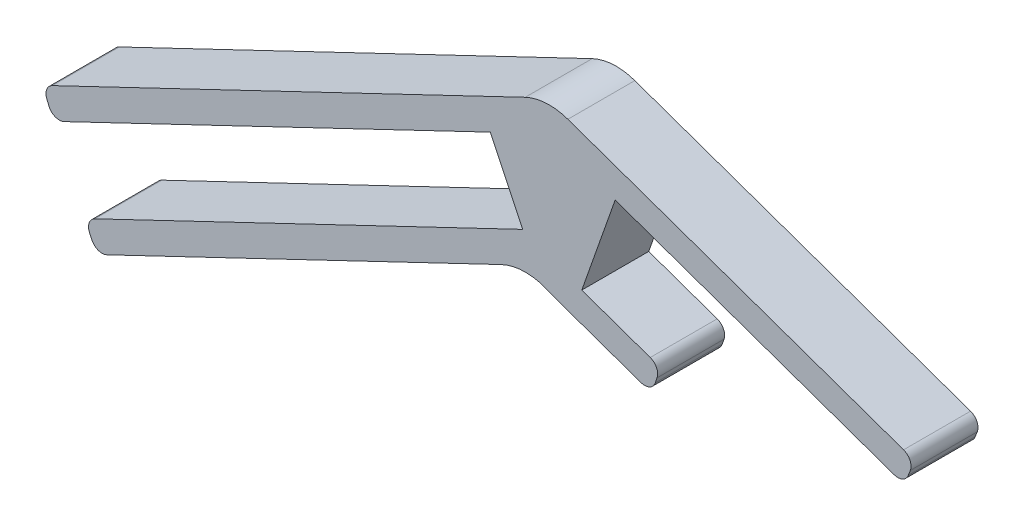
ISO-10303-21;
HEADER;
FILE_DESCRIPTION(('STEP AP214'),'2;1');
FILE_NAME('part.step','',(''),(''),'','','');
FILE_SCHEMA(('AUTOMOTIVE_DESIGN { 1 0 10303 214 1 1 1 1 }'));
ENDSEC;
DATA;
#1=APPLICATION_CONTEXT('core data for automotive mechanical design processes');
#2=APPLICATION_PROTOCOL_DEFINITION('international standard','automotive_design',2000,#1);
#3=PRODUCT_CONTEXT('',#1,'mechanical');
#4=PRODUCT('Part','Part','',(#3));
#5=PRODUCT_RELATED_PRODUCT_CATEGORY('part','',(#4));
#6=PRODUCT_DEFINITION_FORMATION('','',#4);
#7=PRODUCT_DEFINITION_CONTEXT('part definition',#1,'design');
#8=PRODUCT_DEFINITION('design','',#6,#7);
#9=PRODUCT_DEFINITION_SHAPE('','',#8);
#10=(LENGTH_UNIT() NAMED_UNIT(*) SI_UNIT(.MILLI.,.METRE.));
#11=(NAMED_UNIT(*) PLANE_ANGLE_UNIT() SI_UNIT($,.RADIAN.));
#12=(NAMED_UNIT(*) SI_UNIT($,.STERADIAN.) SOLID_ANGLE_UNIT());
#13=UNCERTAINTY_MEASURE_WITH_UNIT(LENGTH_MEASURE(1.E-05),#10,'distance_accuracy_value','');
#14=(GEOMETRIC_REPRESENTATION_CONTEXT(3) GLOBAL_UNCERTAINTY_ASSIGNED_CONTEXT((#13)) GLOBAL_UNIT_ASSIGNED_CONTEXT((#10,
#11,#12)) REPRESENTATION_CONTEXT('',''));
#15=CARTESIAN_POINT('',(0.,0.,0.));
#16=DIRECTION('',(0.,0.,1.));
#17=DIRECTION('',(1.,0.,0.));
#18=AXIS2_PLACEMENT_3D('',#15,#16,#17);
#19=CARTESIAN_POINT('',(61.5968500605202,-23.8454699520847,12.));
#20=DIRECTION('',(0.932560310154677,-0.361014221221563,0.));
#21=DIRECTION('',(0.361014221221563,0.932560310154677,0.));
#22=AXIS2_PLACEMENT_3D('',#19,#20,#21);
#23=PLANE('',#22);
#24=DIRECTION('',(-0.361014221221563,-0.932560310154677,0.));
#25=VECTOR('',#24,1.);
#26=CARTESIAN_POINT('',(61.5968500605202,-23.8454699520847,12.));
#27=LINE('',#26,#25);
#28=CARTESIAN_POINT('',(66.1998726562374,-11.9550902186044,12.));
#29=VERTEX_POINT('',#28);
#30=CARTESIAN_POINT('',(65.8386923064239,-12.8880796667879,12.));
#31=VERTEX_POINT('',#30);
#32=EDGE_CURVE('E291',#29,#31,#27,.T.);
#33=ORIENTED_EDGE('',*,*,#32,.T.);
#34=DIRECTION('',(0.,0.,-1.));
#35=VECTOR('',#34,1.);
#36=CARTESIAN_POINT('',(65.8386923064239,-12.8880796667879,0.));
#37=LINE('',#36,#35);
#38=CARTESIAN_POINT('',(65.8386923064239,-12.8880796667879,0.));
#39=VERTEX_POINT('',#38);
#40=EDGE_CURVE('E347',#31,#39,#37,.T.);
#41=ORIENTED_EDGE('',*,*,#40,.T.);
#42=DIRECTION('',(-0.361014221221563,-0.932560310154677,0.));
#43=VECTOR('',#42,1.);
#44=CARTESIAN_POINT('',(61.5968500605202,-23.8454699520847,0.));
#45=LINE('',#44,#43);
#46=CARTESIAN_POINT('',(66.1998726562374,-11.9550902186044,0.));
#47=VERTEX_POINT('',#46);
#48=EDGE_CURVE('E253',#47,#39,#45,.T.);
#49=ORIENTED_EDGE('',*,*,#48,.F.);
#50=DIRECTION('',(0.,0.,-1.));
#51=VECTOR('',#50,1.);
#52=CARTESIAN_POINT('',(66.1998726562374,-11.9550902186044,12.));
#53=LINE('',#52,#51);
#54=EDGE_CURVE('E345',#47,#29,#53,.F.);
#55=ORIENTED_EDGE('',*,*,#54,.T.);
#56=EDGE_LOOP('',(#33,#41,#49,#55));
#57=FACE_BOUND('',#56,.T.);
#58=ADVANCED_FACE('F35',(#57),#23,.T.);
#59=CARTESIAN_POINT('',(4.25749301558519,12.0732338085579,12.));
#60=DIRECTION('',(0.332566690182013,0.943079740309048,0.));
#61=DIRECTION('',(-0.943079740309048,0.332566690182013,0.));
#62=AXIS2_PLACEMENT_3D('',#59,#60,#61);
#63=PLANE('',#62);
#64=DIRECTION('',(0.943079740309048,-0.332566690182013,0.));
#65=VECTOR('',#64,1.);
#66=CARTESIAN_POINT('',(4.25749301558519,12.0732338085579,12.));
#67=LINE('',#66,#65);
#68=CARTESIAN_POINT('',(4.83492254044177,11.8696096422366,12.));
#69=VERTEX_POINT('',#68);
#70=CARTESIAN_POINT('',(64.9998854162921,-9.34690229554322,12.));
#71=VERTEX_POINT('',#70);
#72=EDGE_CURVE('E473',#69,#71,#67,.T.);
#73=ORIENTED_EDGE('',*,*,#72,.T.);
#74=DIRECTION('',(0.,0.,-1.));
#75=VECTOR('',#74,1.);
#76=CARTESIAN_POINT('',(64.999885416292,-9.34690229554321,12.));
#77=LINE('',#76,#75);
#78=CARTESIAN_POINT('',(64.9998854162921,-9.34690229554322,0.));
#79=VERTEX_POINT('',#78);
#80=EDGE_CURVE('E352',#71,#79,#77,.T.);
#81=ORIENTED_EDGE('',*,*,#80,.T.);
#82=DIRECTION('',(0.943079740309048,-0.332566690182013,0.));
#83=VECTOR('',#82,1.);
#84=CARTESIAN_POINT('',(4.25749301558519,12.0732338085579,0.));
#85=LINE('',#84,#83);
#86=CARTESIAN_POINT('',(4.83492254044177,11.8696096422366,0.));
#87=VERTEX_POINT('',#86);
#88=EDGE_CURVE('E256',#87,#79,#85,.T.);
#89=ORIENTED_EDGE('',*,*,#88,.F.);
#90=DIRECTION('',(0.,0.,-1.));
#91=VECTOR('',#90,1.);
#92=CARTESIAN_POINT('',(4.83492254044177,11.8696096422366,12.));
#93=LINE('',#92,#91);
#94=EDGE_CURVE('E303',#87,#69,#93,.F.);
#95=ORIENTED_EDGE('',*,*,#94,.T.);
#96=EDGE_LOOP('',(#73,#81,#89,#95));
#97=FACE_BOUND('',#96,.T.);
#98=ADVANCED_FACE('F470',(#97),#63,.T.);
#99=CARTESIAN_POINT('',(-4.98538164406063,10.4167868279937,12.));
#100=DIRECTION('',(-0.431697917747711,0.902018241396642,0.));
#101=DIRECTION('',(-0.902018241396642,-0.431697917747711,0.));
#102=AXIS2_PLACEMENT_3D('',#99,#100,#101);
#103=PLANE('',#102);
#104=DIRECTION('',(0.902018241396642,0.431697917747711,0.));
#105=VECTOR('',#104,1.);
#106=CARTESIAN_POINT('',(-4.98538164406063,10.4167868279937,0.));
#107=LINE('',#106,#105);
#108=CARTESIAN_POINT('',(-87.5496802623476,-29.0977530760187,0.));
#109=VERTEX_POINT('',#108);
#110=CARTESIAN_POINT('',(-2.80772353885546,11.4589946531125,0.));
#111=VERTEX_POINT('',#110);
#112=EDGE_CURVE('E259',#109,#111,#107,.T.);
#113=ORIENTED_EDGE('',*,*,#112,.F.);
#114=DIRECTION('',(0.,0.,-1.));
#115=VECTOR('',#114,1.);
#116=CARTESIAN_POINT('',(-87.5496802623476,-29.0977530760187,12.));
#117=LINE('',#116,#115);
#118=CARTESIAN_POINT('',(-87.5496802623476,-29.0977530760187,12.));
#119=VERTEX_POINT('',#118);
#120=EDGE_CURVE('E11',#109,#119,#117,.F.);
#121=ORIENTED_EDGE('',*,*,#120,.T.);
#122=DIRECTION('',(0.902018241396642,0.431697917747711,0.));
#123=VECTOR('',#122,1.);
#124=CARTESIAN_POINT('',(-4.98538164406063,10.4167868279937,12.));
#125=LINE('',#124,#123);
#126=CARTESIAN_POINT('',(-2.80772353885546,11.4589946531125,12.));
#127=VERTEX_POINT('',#126);
#128=EDGE_CURVE('E392',#119,#127,#125,.T.);
#129=ORIENTED_EDGE('',*,*,#128,.T.);
#130=DIRECTION('',(0.,0.,-1.));
#131=VECTOR('',#130,1.);
#132=CARTESIAN_POINT('',(-2.80772353885546,11.4589946531125,12.));
#133=LINE('',#132,#131);
#134=EDGE_CURVE('E220',#127,#111,#133,.T.);
#135=ORIENTED_EDGE('',*,*,#134,.T.);
#136=EDGE_LOOP('',(#113,#121,#129,#135));
#137=FACE_BOUND('',#136,.T.);
#138=ADVANCED_FACE('F480',(#137),#103,.T.);
#139=CARTESIAN_POINT('',(-86.4345541039312,-36.6224392480856,12.));
#140=DIRECTION('',(0.920760796810772,0.390127613809113,0.));
#141=DIRECTION('',(-0.390127613809113,0.920760796810772,0.));
#142=AXIS2_PLACEMENT_3D('',#139,#140,#141);
#143=PLANE('',#142);
#144=DIRECTION('',(0.390127613809113,-0.920760796810772,0.));
#145=VECTOR('',#144,1.);
#146=CARTESIAN_POINT('',(-86.4345541039312,-36.6224392480856,0.));
#147=LINE('',#146,#145);
#148=CARTESIAN_POINT('',(-88.5278060204737,-31.6820447864302,0.));
#149=VERTEX_POINT('',#148);
#150=CARTESIAN_POINT('',(-88.1372723739966,-32.6037638823967,0.));
#151=VERTEX_POINT('',#150);
#152=EDGE_CURVE('E261',#149,#151,#147,.T.);
#153=ORIENTED_EDGE('',*,*,#152,.T.);
#154=DIRECTION('',(0.,0.,-1.));
#155=VECTOR('',#154,1.);
#156=CARTESIAN_POINT('',(-88.1372723739966,-32.6037638823967,12.));
#157=LINE('',#156,#155);
#158=CARTESIAN_POINT('',(-88.1372723739966,-32.6037638823967,12.));
#159=VERTEX_POINT('',#158);
#160=EDGE_CURVE('E43',#151,#159,#157,.F.);
#161=ORIENTED_EDGE('',*,*,#160,.T.);
#162=DIRECTION('',(0.390127613809113,-0.920760796810772,0.));
#163=VECTOR('',#162,1.);
#164=CARTESIAN_POINT('',(-86.4345541039312,-36.6224392480856,12.));
#165=LINE('',#164,#163);
#166=CARTESIAN_POINT('',(-88.5278060204737,-31.6820447864302,12.));
#167=VERTEX_POINT('',#166);
#168=EDGE_CURVE('E210',#167,#159,#165,.T.);
#169=ORIENTED_EDGE('',*,*,#168,.F.);
#170=DIRECTION('',(0.,0.,-1.));
#171=VECTOR('',#170,1.);
#172=CARTESIAN_POINT('',(-88.5278060204737,-31.6820447864302,0.));
#173=LINE('',#172,#171);
#174=EDGE_CURVE('E381',#167,#149,#173,.T.);
#175=ORIENTED_EDGE('',*,*,#174,.T.);
#176=EDGE_LOOP('',(#153,#161,#169,#175));
#177=FACE_BOUND('',#176,.T.);
#178=ADVANCED_FACE('F386',(#177),#143,.F.);
#179=CARTESIAN_POINT('',(-2.82689205532207,5.90669562101049,12.));
#180=DIRECTION('',(-0.431697917747711,0.902018241396642,0.));
#181=DIRECTION('',(-0.902018241396642,-0.431697917747711,0.));
#182=AXIS2_PLACEMENT_3D('',#179,#180,#181);
#183=PLANE('',#182);
#184=DIRECTION('',(0.902018241396642,0.431697917747711,0.));
#185=VECTOR('',#184,1.);
#186=CARTESIAN_POINT('',(-2.82689205532207,5.90669562101049,12.));
#187=LINE('',#186,#185);
#188=CARTESIAN_POINT('',(-85.4323549448797,-33.6275451375718,12.));
#189=VERTEX_POINT('',#188);
#190=CARTESIAN_POINT('',(-9.07000207391761,2.91879862335715,12.));
#191=VERTEX_POINT('',#190);
#192=EDGE_CURVE('E201',#189,#191,#187,.T.);
#193=ORIENTED_EDGE('',*,*,#192,.F.);
#194=DIRECTION('',(0.,0.,-1.));
#195=VECTOR('',#194,1.);
#196=CARTESIAN_POINT('',(-85.4323549448796,-33.6275451375718,12.));
#197=LINE('',#196,#195);
#198=CARTESIAN_POINT('',(-85.4323549448797,-33.6275451375718,0.));
#199=VERTEX_POINT('',#198);
#200=EDGE_CURVE('E379',#189,#199,#197,.T.);
#201=ORIENTED_EDGE('',*,*,#200,.T.);
#202=DIRECTION('',(0.902018241396642,0.431697917747711,0.));
#203=VECTOR('',#202,1.);
#204=CARTESIAN_POINT('',(-2.82689205532207,5.90669562101049,0.));
#205=LINE('',#204,#203);
#206=CARTESIAN_POINT('',(-9.07000207391761,2.91879862335715,0.));
#207=VERTEX_POINT('',#206);
#208=EDGE_CURVE('E216',#199,#207,#205,.T.);
#209=ORIENTED_EDGE('',*,*,#208,.T.);
#210=DIRECTION('',(0.,0.,-1.));
#211=VECTOR('',#210,1.);
#212=CARTESIAN_POINT('',(-9.07000207391761,2.91879862335715,12.));
#213=LINE('',#212,#211);
#214=EDGE_CURVE('E213',#191,#207,#213,.T.);
#215=ORIENTED_EDGE('',*,*,#214,.F.);
#216=EDGE_LOOP('',(#193,#201,#209,#215));
#217=FACE_BOUND('',#216,.T.);
#218=ADVANCED_FACE('F214',(#217),#183,.F.);
#219=CARTESIAN_POINT('',(-6.24311001859554,-2.98789699765333,12.));
#220=DIRECTION('',(-0.902018241396642,-0.431697917747711,0.));
#221=DIRECTION('',(0.431697917747711,-0.902018241396642,0.));
#222=AXIS2_PLACEMENT_3D('',#219,#220,#221);
#223=PLANE('',#222);
#224=DIRECTION('',(-0.431697917747711,0.902018241396642,0.));
#225=VECTOR('',#224,1.);
#226=CARTESIAN_POINT('',(-6.24311001859554,-2.98789699765333,0.));
#227=LINE('',#226,#225);
#228=CARTESIAN_POINT('',(-3.24208018432351,-9.25844763549751,0.));
#229=VERTEX_POINT('',#228);
#230=EDGE_CURVE('E265',#229,#207,#227,.T.);
#231=ORIENTED_EDGE('',*,*,#230,.F.);
#232=DIRECTION('',(0.,0.,-1.));
#233=VECTOR('',#232,1.);
#234=CARTESIAN_POINT('',(-3.24208018432351,-9.25844763549751,12.));
#235=LINE('',#234,#233);
#236=CARTESIAN_POINT('',(-3.24208018432351,-9.25844763549751,12.));
#237=VERTEX_POINT('',#236);
#238=EDGE_CURVE('E221',#237,#229,#235,.T.);
#239=ORIENTED_EDGE('',*,*,#238,.F.);
#240=DIRECTION('',(-0.431697917747711,0.902018241396642,0.));
#241=VECTOR('',#240,1.);
#242=CARTESIAN_POINT('',(-6.24311001859554,-2.98789699765333,12.));
#243=LINE('',#242,#241);
#244=EDGE_CURVE('E206',#237,#191,#243,.T.);
#245=ORIENTED_EDGE('',*,*,#244,.T.);
#246=ORIENTED_EDGE('',*,*,#214,.T.);
#247=EDGE_LOOP('',(#231,#239,#245,#246));
#248=FACE_BOUND('',#247,.T.);
#249=ADVANCED_FACE('F224',(#248),#223,.T.);
#250=CARTESIAN_POINT('',(3.00102983427203,-6.27055063784417,12.));
#251=DIRECTION('',(-0.431697917747711,0.902018241396642,0.));
#252=DIRECTION('',(-0.902018241396642,-0.431697917747711,0.));
#253=AXIS2_PLACEMENT_3D('',#250,#251,#252);
#254=PLANE('',#253);
#255=DIRECTION('',(0.902018241396642,0.431697917747711,0.));
#256=VECTOR('',#255,1.);
#257=CARTESIAN_POINT('',(3.00102983427203,-6.27055063784417,0.));
#258=LINE('',#257,#256);
#259=CARTESIAN_POINT('',(-79.9233276750008,-45.9574115286966,0.));
#260=VERTEX_POINT('',#259);
#261=EDGE_CURVE('E267',#260,#229,#258,.T.);
#262=ORIENTED_EDGE('',*,*,#261,.F.);
#263=DIRECTION('',(0.,0.,-1.));
#264=VECTOR('',#263,1.);
#265=CARTESIAN_POINT('',(-79.9233276750008,-45.9574115286966,12.));
#266=LINE('',#265,#264);
#267=CARTESIAN_POINT('',(-79.9233276750008,-45.9574115286966,12.));
#268=VERTEX_POINT('',#267);
#269=EDGE_CURVE('E50',#260,#268,#266,.F.);
#270=ORIENTED_EDGE('',*,*,#269,.T.);
#271=DIRECTION('',(0.902018241396642,0.431697917747711,0.));
#272=VECTOR('',#271,1.);
#273=CARTESIAN_POINT('',(3.00102983427203,-6.27055063784417,12.));
#274=LINE('',#273,#272);
#275=EDGE_CURVE('E226',#268,#237,#274,.T.);
#276=ORIENTED_EDGE('',*,*,#275,.T.);
#277=ORIENTED_EDGE('',*,*,#238,.T.);
#278=EDGE_LOOP('',(#262,#270,#276,#277));
#279=FACE_BOUND('',#278,.T.);
#280=ADVANCED_FACE('F398',(#279),#254,.T.);
#281=CARTESIAN_POINT('',(-84.9008751258718,-40.071852955632,12.));
#282=DIRECTION('',(0.904331819087131,0.426830131301153,0.));
#283=DIRECTION('',(-0.426830131301154,0.904331819087132,0.));
#284=AXIS2_PLACEMENT_3D('',#281,#282,#283);
#285=PLANE('',#284);
#286=DIRECTION('',(0.426830131301153,-0.904331819087131,0.));
#287=VECTOR('',#286,1.);
#288=CARTESIAN_POINT('',(-84.9008751258718,-40.071852955632,0.));
#289=LINE('',#288,#287);
#290=CARTESIAN_POINT('',(-80.8685954776796,-48.6151082740922,0.));
#291=VERTEX_POINT('',#290);
#292=CARTESIAN_POINT('',(-80.4417591470105,-49.5194532278793,0.));
#293=VERTEX_POINT('',#292);
#294=EDGE_CURVE('E269',#291,#293,#289,.T.);
#295=ORIENTED_EDGE('',*,*,#294,.T.);
#296=DIRECTION('',(0.,0.,-1.));
#297=VECTOR('',#296,1.);
#298=CARTESIAN_POINT('',(-80.4417591470105,-49.5194532278793,12.));
#299=LINE('',#298,#297);
#300=CARTESIAN_POINT('',(-80.4417591470105,-49.5194532278793,12.));
#301=VERTEX_POINT('',#300);
#302=EDGE_CURVE('E369',#293,#301,#299,.F.);
#303=ORIENTED_EDGE('',*,*,#302,.T.);
#304=DIRECTION('',(0.426830131301153,-0.904331819087131,0.));
#305=VECTOR('',#304,1.);
#306=CARTESIAN_POINT('',(-84.9008751258718,-40.071852955632,12.));
#307=LINE('',#306,#305);
#308=CARTESIAN_POINT('',(-80.8685954776796,-48.6151082740922,12.));
#309=VERTEX_POINT('',#308);
#310=EDGE_CURVE('E228',#309,#301,#307,.T.);
#311=ORIENTED_EDGE('',*,*,#310,.F.);
#312=DIRECTION('',(0.,0.,-1.));
#313=VECTOR('',#312,1.);
#314=CARTESIAN_POINT('',(-80.8685954776796,-48.6151082740922,0.));
#315=LINE('',#314,#313);
#316=EDGE_CURVE('E366',#309,#291,#315,.T.);
#317=ORIENTED_EDGE('',*,*,#316,.T.);
#318=EDGE_LOOP('',(#295,#303,#311,#317));
#319=FACE_BOUND('',#318,.T.);
#320=ADVANCED_FACE('F405',(#319),#285,.F.);
#321=CARTESIAN_POINT('',(5.15951942301058,-10.7806418448274,12.));
#322=DIRECTION('',(-0.431697917747711,0.902018241396642,0.));
#323=DIRECTION('',(-0.902018241396642,-0.431697917747711,0.));
#324=AXIS2_PLACEMENT_3D('',#321,#322,#323);
#325=PLANE('',#324);
#326=DIRECTION('',(0.902018241396642,0.431697917747711,0.));
#327=VECTOR('',#326,1.);
#328=CARTESIAN_POINT('',(5.15951942301058,-10.7806418448274,12.));
#329=LINE('',#328,#327);
#330=CARTESIAN_POINT('',(-77.7696996733408,-50.4698294480703,12.));
#331=VERTEX_POINT('',#330);
#332=CARTESIAN_POINT('',(-7.08252077303891,-16.6395735372015,12.));
#333=VERTEX_POINT('',#332);
#334=EDGE_CURVE('E233',#331,#333,#329,.T.);
#335=ORIENTED_EDGE('',*,*,#334,.F.);
#336=DIRECTION('',(0.,0.,-1.));
#337=VECTOR('',#336,1.);
#338=CARTESIAN_POINT('',(-77.7696996733408,-50.4698294480703,12.));
#339=LINE('',#338,#337);
#340=CARTESIAN_POINT('',(-77.7696996733408,-50.4698294480703,0.));
#341=VERTEX_POINT('',#340);
#342=EDGE_CURVE('E355',#331,#341,#339,.T.);
#343=ORIENTED_EDGE('',*,*,#342,.T.);
#344=DIRECTION('',(0.902018241396642,0.431697917747711,0.));
#345=VECTOR('',#344,1.);
#346=CARTESIAN_POINT('',(5.15951942301058,-10.7806418448274,0.));
#347=LINE('',#346,#345);
#348=CARTESIAN_POINT('',(-7.08252077303891,-16.6395735372015,0.));
#349=VERTEX_POINT('',#348);
#350=EDGE_CURVE('E272',#341,#349,#347,.T.);
#351=ORIENTED_EDGE('',*,*,#350,.T.);
#352=DIRECTION('',(0.,0.,-1.));
#353=VECTOR('',#352,1.);
#354=CARTESIAN_POINT('',(-7.08252077303891,-16.6395735372015,12.));
#355=LINE('',#354,#353);
#356=EDGE_CURVE('E311',#349,#333,#355,.F.);
#357=ORIENTED_EDGE('',*,*,#356,.T.);
#358=EDGE_LOOP('',(#335,#343,#351,#357));
#359=FACE_BOUND('',#358,.T.);
#360=ADVANCED_FACE('F413',(#359),#325,.F.);
#361=CARTESIAN_POINT('',(-5.24107159900194,-14.0656889943379,12.));
#362=DIRECTION('',(-0.34916243126016,-0.937062215968873,0.));
#363=DIRECTION('',(0.937062215968873,-0.34916243126016,0.));
#364=AXIS2_PLACEMENT_3D('',#361,#362,#363);
#365=PLANE('',#364);
#366=DIRECTION('',(-0.937062215968873,0.34916243126016,0.));
#367=VECTOR('',#366,1.);
#368=CARTESIAN_POINT('',(-5.24107159900194,-14.0656889943379,12.));
#369=LINE('',#368,#367);
#370=CARTESIAN_POINT('',(4.84522923906958,-17.8239851490933,12.));
#371=VERTEX_POINT('',#370);
#372=CARTESIAN_POINT('',(0.726082717039799,-16.2891337914792,12.));
#373=VERTEX_POINT('',#372);
#374=EDGE_CURVE('E235',#371,#373,#369,.T.);
#375=ORIENTED_EDGE('',*,*,#374,.T.);
#376=DIRECTION('',(0.,0.,-1.));
#377=VECTOR('',#376,1.);
#378=CARTESIAN_POINT('',(0.726082717039799,-16.2891337914792,12.));
#379=LINE('',#378,#377);
#380=CARTESIAN_POINT('',(0.726082717039799,-16.2891337914792,0.));
#381=VERTEX_POINT('',#380);
#382=EDGE_CURVE('E308',#373,#381,#379,.T.);
#383=ORIENTED_EDGE('',*,*,#382,.T.);
#384=DIRECTION('',(-0.937062215968873,0.34916243126016,0.));
#385=VECTOR('',#384,1.);
#386=CARTESIAN_POINT('',(-5.24107159900194,-14.0656889943379,0.));
#387=LINE('',#386,#385);
#388=CARTESIAN_POINT('',(4.84522923906958,-17.8239851490933,0.));
#389=VERTEX_POINT('',#388);
#390=EDGE_CURVE('E274',#389,#381,#387,.T.);
#391=ORIENTED_EDGE('',*,*,#390,.F.);
#392=DIRECTION('',(0.,0.,-1.));
#393=VECTOR('',#392,1.);
#394=CARTESIAN_POINT('',(4.84522923906958,-17.8239851490933,12.));
#395=LINE('',#394,#393);
#396=EDGE_CURVE('E296',#371,#389,#395,.T.);
#397=ORIENTED_EDGE('',*,*,#396,.F.);
#398=EDGE_LOOP('',(#375,#383,#391,#397));
#399=FACE_BOUND('',#398,.T.);
#400=ADVANCED_FACE('F420',(#399),#365,.T.);
#401=CARTESIAN_POINT('',(-5.05437430951122,-14.3329989200956,12.));
#402=DIRECTION('',(0.332566690182013,0.943079740309048,0.));
#403=DIRECTION('',(-0.943079740309048,0.332566690182013,0.));
#404=AXIS2_PLACEMENT_3D('',#401,#402,#403);
#405=PLANE('',#404);
#406=DIRECTION('',(0.943079740309048,-0.332566690182013,0.));
#407=VECTOR('',#406,1.);
#408=CARTESIAN_POINT('',(-5.05437430951122,-14.3329989200956,0.));
#409=LINE('',#408,#407);
#410=CARTESIAN_POINT('',(17.9393151296957,-22.4414704151616,0.));
#411=VERTEX_POINT('',#410);
#412=EDGE_CURVE('E277',#389,#411,#409,.T.);
#413=ORIENTED_EDGE('',*,*,#412,.T.);
#414=DIRECTION('',(0.,0.,-1.));
#415=VECTOR('',#414,1.);
#416=CARTESIAN_POINT('',(17.9393151296957,-22.4414704151616,12.));
#417=LINE('',#416,#415);
#418=CARTESIAN_POINT('',(17.9393151296957,-22.4414704151616,12.));
#419=VERTEX_POINT('',#418);
#420=EDGE_CURVE('E332',#411,#419,#417,.F.);
#421=ORIENTED_EDGE('',*,*,#420,.T.);
#422=DIRECTION('',(0.943079740309048,-0.332566690182013,0.));
#423=VECTOR('',#422,1.);
#424=CARTESIAN_POINT('',(-5.05437430951122,-14.3329989200956,12.));
#425=LINE('',#424,#423);
#426=EDGE_CURVE('E238',#371,#419,#425,.T.);
#427=ORIENTED_EDGE('',*,*,#426,.F.);
#428=ORIENTED_EDGE('',*,*,#396,.T.);
#429=EDGE_LOOP('',(#413,#421,#427,#428));
#430=FACE_BOUND('',#429,.T.);
#431=ADVANCED_FACE('F428',(#430),#405,.F.);
#432=CARTESIAN_POINT('',(24.8604985551721,-8.62532102043883,12.));
#433=DIRECTION('',(-0.944753668791573,0.327781185098935,0.));
#434=DIRECTION('',(-0.327781185098935,-0.944753668791573,0.));
#435=AXIS2_PLACEMENT_3D('',#432,#433,#434);
#436=PLANE('',#435);
#437=DIRECTION('',(0.327781185098935,0.944753668791573,0.));
#438=VECTOR('',#437,1.);
#439=CARTESIAN_POINT('',(24.8604985551721,-8.62532102043883,12.));
#440=LINE('',#439,#438);
#441=CARTESIAN_POINT('',(20.4939558476429,-21.2108733047414,12.));
#442=VERTEX_POINT('',#441);
#443=CARTESIAN_POINT('',(20.8217412452915,-20.2661074942469,12.));
#444=VERTEX_POINT('',#443);
#445=EDGE_CURVE('E241',#442,#444,#440,.T.);
#446=ORIENTED_EDGE('',*,*,#445,.F.);
#447=DIRECTION('',(0.,0.,-1.));
#448=VECTOR('',#447,1.);
#449=CARTESIAN_POINT('',(20.4939558476429,-21.2108733047414,12.));
#450=LINE('',#449,#448);
#451=CARTESIAN_POINT('',(20.4939558476429,-21.2108733047414,0.));
#452=VERTEX_POINT('',#451);
#453=EDGE_CURVE('E321',#442,#452,#450,.T.);
#454=ORIENTED_EDGE('',*,*,#453,.T.);
#455=DIRECTION('',(0.327781185098935,0.944753668791573,0.));
#456=VECTOR('',#455,1.);
#457=CARTESIAN_POINT('',(24.8604985551721,-8.62532102043883,0.));
#458=LINE('',#457,#456);
#459=CARTESIAN_POINT('',(20.8217412452915,-20.2661074942469,0.));
#460=VERTEX_POINT('',#459);
#461=EDGE_CURVE('E280',#452,#460,#458,.T.);
#462=ORIENTED_EDGE('',*,*,#461,.T.);
#463=DIRECTION('',(0.,0.,-1.));
#464=VECTOR('',#463,1.);
#465=CARTESIAN_POINT('',(20.8217412452915,-20.2661074942469,12.));
#466=LINE('',#465,#464);
#467=EDGE_CURVE('E319',#460,#444,#466,.F.);
#468=ORIENTED_EDGE('',*,*,#467,.T.);
#469=EDGE_LOOP('',(#446,#454,#462,#468));
#470=FACE_BOUND('',#469,.T.);
#471=ADVANCED_FACE('F436',(#470),#436,.F.);
#472=CARTESIAN_POINT('',(-3.39154085860116,-9.61760021855037,12.));
#473=DIRECTION('',(0.332566690182013,0.943079740309048,0.));
#474=DIRECTION('',(-0.943079740309048,0.332566690182013,0.));
#475=AXIS2_PLACEMENT_3D('',#472,#473,#474);
#476=PLANE('',#475);
#477=DIRECTION('',(0.943079740309048,-0.332566690182013,0.));
#478=VECTOR('',#477,1.);
#479=CARTESIAN_POINT('',(-3.39154085860116,-9.61760021855037,12.));
#480=LINE('',#479,#478);
#481=CARTESIAN_POINT('',(7.32779231936807,-13.3976550787971,12.));
#482=VERTEX_POINT('',#481);
#483=CARTESIAN_POINT('',(19.5973672880724,-17.7243856434309,12.));
#484=VERTEX_POINT('',#483);
#485=EDGE_CURVE('E244',#482,#484,#480,.T.);
#486=ORIENTED_EDGE('',*,*,#485,.T.);
#487=DIRECTION('',(0.,0.,-1.));
#488=VECTOR('',#487,1.);
#489=CARTESIAN_POINT('',(19.5973672880723,-17.7243856434309,0.));
#490=LINE('',#489,#488);
#491=CARTESIAN_POINT('',(19.5973672880724,-17.7243856434309,0.));
#492=VERTEX_POINT('',#491);
#493=EDGE_CURVE('E342',#484,#492,#490,.T.);
#494=ORIENTED_EDGE('',*,*,#493,.T.);
#495=DIRECTION('',(0.943079740309048,-0.332566690182013,0.));
#496=VECTOR('',#495,1.);
#497=CARTESIAN_POINT('',(-3.39154085860116,-9.61760021855037,0.));
#498=LINE('',#497,#496);
#499=CARTESIAN_POINT('',(7.32779231936807,-13.3976550787971,0.));
#500=VERTEX_POINT('',#499);
#501=EDGE_CURVE('E283',#500,#492,#498,.T.);
#502=ORIENTED_EDGE('',*,*,#501,.F.);
#503=DIRECTION('',(0.,0.,-1.));
#504=VECTOR('',#503,1.);
#505=CARTESIAN_POINT('',(7.32779231936807,-13.3976550787971,12.));
#506=LINE('',#505,#504);
#507=EDGE_CURVE('E294',#482,#500,#506,.T.);
#508=ORIENTED_EDGE('',*,*,#507,.F.);
#509=EDGE_LOOP('',(#486,#494,#502,#508));
#510=FACE_BOUND('',#509,.T.);
#511=ADVANCED_FACE('F443',(#510),#476,.T.);
#512=CARTESIAN_POINT('',(10.7193331779692,-3.78005486024675,12.));
#513=DIRECTION('',(-0.943079740309048,0.332566690182013,0.));
#514=DIRECTION('',(-0.332566690182013,-0.943079740309048,0.));
#515=AXIS2_PLACEMENT_3D('',#512,#513,#514);
#516=PLANE('',#515);
#517=DIRECTION('',(0.332566690182013,0.943079740309048,0.));
#518=VECTOR('',#517,1.);
#519=CARTESIAN_POINT('',(10.7193331779692,-3.78005486024675,0.));
#520=LINE('',#519,#518);
#521=CARTESIAN_POINT('',(13.3139927426443,3.57778024676573,0.));
#522=VERTEX_POINT('',#521);
#523=EDGE_CURVE('E286',#500,#522,#520,.T.);
#524=ORIENTED_EDGE('',*,*,#523,.T.);
#525=DIRECTION('',(0.,0.,-1.));
#526=VECTOR('',#525,1.);
#527=CARTESIAN_POINT('',(13.3139927426443,3.57778024676573,12.));
#528=LINE('',#527,#526);
#529=CARTESIAN_POINT('',(13.3139927426443,3.57778024676573,12.));
#530=VERTEX_POINT('',#529);
#531=EDGE_CURVE('E252',#530,#522,#528,.T.);
#532=ORIENTED_EDGE('',*,*,#531,.F.);
#533=DIRECTION('',(0.332566690182013,0.943079740309048,0.));
#534=VECTOR('',#533,1.);
#535=CARTESIAN_POINT('',(10.7193331779692,-3.78005486024675,12.));
#536=LINE('',#535,#534);
#537=EDGE_CURVE('E247',#482,#530,#536,.T.);
#538=ORIENTED_EDGE('',*,*,#537,.F.);
#539=ORIENTED_EDGE('',*,*,#507,.T.);
#540=EDGE_LOOP('',(#524,#532,#538,#539));
#541=FACE_BOUND('',#540,.T.);
#542=ADVANCED_FACE('F449',(#541),#516,.F.);
#543=CARTESIAN_POINT('',(2.59465956467508,7.35783510701248,12.));
#544=DIRECTION('',(0.332566690182013,0.943079740309048,0.));
#545=DIRECTION('',(-0.943079740309048,0.332566690182013,0.));
#546=AXIS2_PLACEMENT_3D('',#543,#544,#545);
#547=PLANE('',#546);
#548=DIRECTION('',(0.943079740309048,-0.332566690182013,0.));
#549=VECTOR('',#548,1.);
#550=CARTESIAN_POINT('',(2.59465956467508,7.35783510701248,0.));
#551=LINE('',#550,#549);
#552=CARTESIAN_POINT('',(63.3084383057505,-14.0522107049628,0.));
#553=VERTEX_POINT('',#552);
#554=EDGE_CURVE('E288',#522,#553,#551,.T.);
#555=ORIENTED_EDGE('',*,*,#554,.T.);
#556=DIRECTION('',(0.,0.,-1.));
#557=VECTOR('',#556,1.);
#558=CARTESIAN_POINT('',(63.3084383057505,-14.0522107049628,12.));
#559=LINE('',#558,#557);
#560=CARTESIAN_POINT('',(63.3084383057505,-14.0522107049628,12.));
#561=VERTEX_POINT('',#560);
#562=EDGE_CURVE('E350',#553,#561,#559,.F.);
#563=ORIENTED_EDGE('',*,*,#562,.T.);
#564=DIRECTION('',(0.943079740309048,-0.332566690182013,0.));
#565=VECTOR('',#564,1.);
#566=CARTESIAN_POINT('',(2.59465956467508,7.35783510701248,12.));
#567=LINE('',#566,#565);
#568=EDGE_CURVE('E249',#530,#561,#567,.T.);
#569=ORIENTED_EDGE('',*,*,#568,.F.);
#570=ORIENTED_EDGE('',*,*,#531,.T.);
#571=EDGE_LOOP('',(#555,#563,#569,#570));
#572=FACE_BOUND('',#571,.T.);
#573=ADVANCED_FACE('F583',(#572),#547,.F.);
#574=CARTESIAN_POINT('',(0.,0.,12.));
#575=DIRECTION('',(0.,0.,1.));
#576=DIRECTION('',(1.,0.,0.));
#577=AXIS2_PLACEMENT_3D('',#574,#575,#576);
#578=PLANE('',#577);
#579=ORIENTED_EDGE('',*,*,#310,.T.);
#580=CARTESIAN_POINT('',(-78.6330955088362,-48.665792965277,12.));
#581=DIRECTION('',(0.,0.,1.));
#582=DIRECTION('',(1.,0.,0.));
#583=AXIS2_PLACEMENT_3D('',#580,#581,#582);
#584=CIRCLE('',#583,2.);
#585=EDGE_CURVE('E376',#301,#331,#584,.T.);
#586=ORIENTED_EDGE('',*,*,#585,.T.);
#587=ORIENTED_EDGE('',*,*,#334,.T.);
#588=CARTESIAN_POINT('',(-2.7655415955618,-25.6597559511679,12.));
#589=DIRECTION('',(0.,0.,1.));
#590=DIRECTION('',(1.,0.,0.));
#591=AXIS2_PLACEMENT_3D('',#588,#589,#590);
#592=CIRCLE('',#591,10.);
#593=EDGE_CURVE('E317',#333,#373,#592,.F.);
#594=ORIENTED_EDGE('',*,*,#593,.T.);
#595=ORIENTED_EDGE('',*,*,#374,.F.);
#596=ORIENTED_EDGE('',*,*,#426,.T.);
#597=CARTESIAN_POINT('',(18.6044485100597,-20.5553109345435,12.));
#598=DIRECTION('',(0.,0.,1.));
#599=DIRECTION('',(1.,0.,0.));
#600=AXIS2_PLACEMENT_3D('',#597,#598,#599);
#601=CIRCLE('',#600,2.);
#602=EDGE_CURVE('E340',#419,#442,#601,.T.);
#603=ORIENTED_EDGE('',*,*,#602,.T.);
#604=ORIENTED_EDGE('',*,*,#445,.T.);
#605=CARTESIAN_POINT('',(18.9322339077083,-19.610545124049,12.));
#606=DIRECTION('',(0.,0.,1.));
#607=DIRECTION('',(1.,0.,0.));
#608=AXIS2_PLACEMENT_3D('',#605,#606,#607);
#609=CIRCLE('',#608,2.);
#610=EDGE_CURVE('E338',#444,#484,#609,.T.);
#611=ORIENTED_EDGE('',*,*,#610,.T.);
#612=ORIENTED_EDGE('',*,*,#485,.F.);
#613=ORIENTED_EDGE('',*,*,#537,.T.);
#614=ORIENTED_EDGE('',*,*,#568,.T.);
#615=CARTESIAN_POINT('',(63.9735716861145,-12.1660512243447,12.));
#616=DIRECTION('',(0.,0.,1.));
#617=DIRECTION('',(1.,0.,0.));
#618=AXIS2_PLACEMENT_3D('',#615,#616,#617);
#619=CIRCLE('',#618,2.);
#620=EDGE_CURVE('E336',#561,#31,#619,.T.);
#621=ORIENTED_EDGE('',*,*,#620,.T.);
#622=ORIENTED_EDGE('',*,*,#32,.F.);
#623=CARTESIAN_POINT('',(64.334752035928,-11.2330617761613,12.));
#624=DIRECTION('',(0.,0.,1.));
#625=DIRECTION('',(1.,0.,0.));
#626=AXIS2_PLACEMENT_3D('',#623,#624,#625);
#627=CIRCLE('',#626,2.);
#628=EDGE_CURVE('E334',#29,#71,#627,.T.);
#629=ORIENTED_EDGE('',*,*,#628,.T.);
#630=ORIENTED_EDGE('',*,*,#72,.F.);
#631=CARTESIAN_POINT('',(1.50925563862164,2.43881223914611,12.));
#632=DIRECTION('',(0.,0.,1.));
#633=DIRECTION('',(1.,0.,0.));
#634=AXIS2_PLACEMENT_3D('',#631,#632,#633);
#635=CIRCLE('',#634,10.);
#636=EDGE_CURVE('E305',#69,#127,#635,.T.);
#637=ORIENTED_EDGE('',*,*,#636,.T.);
#638=ORIENTED_EDGE('',*,*,#128,.F.);
#639=CARTESIAN_POINT('',(-86.6862844268522,-30.901789558812,12.));
#640=DIRECTION('',(0.,0.,1.));
#641=DIRECTION('',(1.,0.,0.));
#642=AXIS2_PLACEMENT_3D('',#639,#640,#641);
#643=CIRCLE('',#642,2.);
#644=EDGE_CURVE('E371',#119,#167,#643,.T.);
#645=ORIENTED_EDGE('',*,*,#644,.T.);
#646=ORIENTED_EDGE('',*,*,#168,.T.);
#647=CARTESIAN_POINT('',(-86.2957507803751,-31.8235086547785,12.));
#648=DIRECTION('',(0.,0.,1.));
#649=DIRECTION('',(1.,0.,0.));
#650=AXIS2_PLACEMENT_3D('',#647,#648,#649);
#651=CIRCLE('',#650,2.);
#652=EDGE_CURVE('E58',#159,#189,#651,.T.);
#653=ORIENTED_EDGE('',*,*,#652,.T.);
#654=ORIENTED_EDGE('',*,*,#192,.T.);
#655=ORIENTED_EDGE('',*,*,#244,.F.);
#656=ORIENTED_EDGE('',*,*,#275,.F.);
#657=CARTESIAN_POINT('',(-79.0599318395054,-47.7614480114898,12.));
#658=DIRECTION('',(0.,0.,1.));
#659=DIRECTION('',(1.,0.,0.));
#660=AXIS2_PLACEMENT_3D('',#657,#658,#659);
#661=CIRCLE('',#660,2.);
#662=EDGE_CURVE('E374',#268,#309,#661,.T.);
#663=ORIENTED_EDGE('',*,*,#662,.T.);
#664=EDGE_LOOP('',(#579,#586,#587,#594,#595,#596,#603,#604,#611,#612,#613,#614,#621,#622,#629,
#630,#637,#638,#645,#646,#653,#654,#655,#656,#663));
#665=FACE_BOUND('',#664,.T.);
#666=ADVANCED_FACE('F204',(#665),#578,.T.);
#667=CARTESIAN_POINT('',(0.,0.,0.));
#668=DIRECTION('',(0.,0.,1.));
#669=DIRECTION('',(1.,0.,0.));
#670=AXIS2_PLACEMENT_3D('',#667,#668,#669);
#671=PLANE('',#670);
#672=ORIENTED_EDGE('',*,*,#350,.F.);
#673=CARTESIAN_POINT('',(-78.6330955088362,-48.665792965277,0.));
#674=DIRECTION('',(0.,0.,1.));
#675=DIRECTION('',(1.,0.,0.));
#676=AXIS2_PLACEMENT_3D('',#673,#674,#675);
#677=CIRCLE('',#676,2.);
#678=EDGE_CURVE('E364',#341,#293,#677,.F.);
#679=ORIENTED_EDGE('',*,*,#678,.T.);
#680=ORIENTED_EDGE('',*,*,#294,.F.);
#681=CARTESIAN_POINT('',(-79.0599318395054,-47.7614480114898,0.));
#682=DIRECTION('',(0.,0.,1.));
#683=DIRECTION('',(1.,0.,0.));
#684=AXIS2_PLACEMENT_3D('',#681,#682,#683);
#685=CIRCLE('',#684,2.);
#686=EDGE_CURVE('E362',#291,#260,#685,.F.);
#687=ORIENTED_EDGE('',*,*,#686,.T.);
#688=ORIENTED_EDGE('',*,*,#261,.T.);
#689=ORIENTED_EDGE('',*,*,#230,.T.);
#690=ORIENTED_EDGE('',*,*,#208,.F.);
#691=CARTESIAN_POINT('',(-86.2957507803751,-31.8235086547785,0.));
#692=DIRECTION('',(0.,0.,1.));
#693=DIRECTION('',(1.,0.,0.));
#694=AXIS2_PLACEMENT_3D('',#691,#692,#693);
#695=CIRCLE('',#694,2.);
#696=EDGE_CURVE('E360',#199,#151,#695,.F.);
#697=ORIENTED_EDGE('',*,*,#696,.T.);
#698=ORIENTED_EDGE('',*,*,#152,.F.);
#699=CARTESIAN_POINT('',(-86.6862844268522,-30.901789558812,0.));
#700=DIRECTION('',(0.,0.,1.));
#701=DIRECTION('',(1.,0.,0.));
#702=AXIS2_PLACEMENT_3D('',#699,#700,#701);
#703=CIRCLE('',#702,2.);
#704=EDGE_CURVE('E358',#149,#109,#703,.F.);
#705=ORIENTED_EDGE('',*,*,#704,.T.);
#706=ORIENTED_EDGE('',*,*,#112,.T.);
#707=CARTESIAN_POINT('',(1.50925563862164,2.43881223914611,0.));
#708=DIRECTION('',(0.,0.,1.));
#709=DIRECTION('',(1.,0.,0.));
#710=AXIS2_PLACEMENT_3D('',#707,#708,#709);
#711=CIRCLE('',#710,10.);
#712=EDGE_CURVE('E301',#111,#87,#711,.F.);
#713=ORIENTED_EDGE('',*,*,#712,.T.);
#714=ORIENTED_EDGE('',*,*,#88,.T.);
#715=CARTESIAN_POINT('',(64.334752035928,-11.2330617761613,0.));
#716=DIRECTION('',(0.,0.,1.));
#717=DIRECTION('',(1.,0.,0.));
#718=AXIS2_PLACEMENT_3D('',#715,#716,#717);
#719=CIRCLE('',#718,2.);
#720=EDGE_CURVE('E324',#79,#47,#719,.F.);
#721=ORIENTED_EDGE('',*,*,#720,.T.);
#722=ORIENTED_EDGE('',*,*,#48,.T.);
#723=CARTESIAN_POINT('',(63.9735716861145,-12.1660512243447,0.));
#724=DIRECTION('',(0.,0.,1.));
#725=DIRECTION('',(1.,0.,0.));
#726=AXIS2_PLACEMENT_3D('',#723,#724,#725);
#727=CIRCLE('',#726,2.);
#728=EDGE_CURVE('E326',#39,#553,#727,.F.);
#729=ORIENTED_EDGE('',*,*,#728,.T.);
#730=ORIENTED_EDGE('',*,*,#554,.F.);
#731=ORIENTED_EDGE('',*,*,#523,.F.);
#732=ORIENTED_EDGE('',*,*,#501,.T.);
#733=CARTESIAN_POINT('',(18.9322339077083,-19.610545124049,0.));
#734=DIRECTION('',(0.,0.,1.));
#735=DIRECTION('',(1.,0.,0.));
#736=AXIS2_PLACEMENT_3D('',#733,#734,#735);
#737=CIRCLE('',#736,2.);
#738=EDGE_CURVE('E328',#492,#460,#737,.F.);
#739=ORIENTED_EDGE('',*,*,#738,.T.);
#740=ORIENTED_EDGE('',*,*,#461,.F.);
#741=CARTESIAN_POINT('',(18.6044485100597,-20.5553109345435,0.));
#742=DIRECTION('',(0.,0.,1.));
#743=DIRECTION('',(1.,0.,0.));
#744=AXIS2_PLACEMENT_3D('',#741,#742,#743);
#745=CIRCLE('',#744,2.);
#746=EDGE_CURVE('E330',#452,#411,#745,.F.);
#747=ORIENTED_EDGE('',*,*,#746,.T.);
#748=ORIENTED_EDGE('',*,*,#412,.F.);
#749=ORIENTED_EDGE('',*,*,#390,.T.);
#750=CARTESIAN_POINT('',(-2.7655415955618,-25.6597559511679,0.));
#751=DIRECTION('',(0.,0.,1.));
#752=DIRECTION('',(1.,0.,0.));
#753=AXIS2_PLACEMENT_3D('',#750,#751,#752);
#754=CIRCLE('',#753,10.);
#755=EDGE_CURVE('E314',#381,#349,#754,.T.);
#756=ORIENTED_EDGE('',*,*,#755,.T.);
#757=EDGE_LOOP('',(#672,#679,#680,#687,#688,#689,#690,#697,#698,#705,#706,#713,#714,#721,#722,
#729,#730,#731,#732,#739,#740,#747,#748,#749,#756));
#758=FACE_BOUND('',#757,.T.);
#759=ADVANCED_FACE('F396',(#758),#671,.F.);
#760=CARTESIAN_POINT('',(1.50925563862164,2.43881223914611,12.));
#761=DIRECTION('',(0.,0.,-1.));
#762=DIRECTION('',(-1.,0.,0.));
#763=AXIS2_PLACEMENT_3D('',#760,#761,#762);
#764=CYLINDRICAL_SURFACE('',#763,10.);
#765=ORIENTED_EDGE('',*,*,#636,.F.);
#766=ORIENTED_EDGE('',*,*,#94,.F.);
#767=ORIENTED_EDGE('',*,*,#712,.F.);
#768=ORIENTED_EDGE('',*,*,#134,.F.);
#769=EDGE_LOOP('',(#765,#766,#767,#768));
#770=FACE_BOUND('',#769,.T.);
#771=ADVANCED_FACE('F485',(#770),#764,.T.);
#772=CARTESIAN_POINT('',(-2.7655415955618,-25.6597559511679,12.));
#773=DIRECTION('',(0.,0.,-1.));
#774=DIRECTION('',(-1.,0.,0.));
#775=AXIS2_PLACEMENT_3D('',#772,#773,#774);
#776=CYLINDRICAL_SURFACE('',#775,10.);
#777=ORIENTED_EDGE('',*,*,#593,.F.);
#778=ORIENTED_EDGE('',*,*,#356,.F.);
#779=ORIENTED_EDGE('',*,*,#755,.F.);
#780=ORIENTED_EDGE('',*,*,#382,.F.);
#781=EDGE_LOOP('',(#777,#778,#779,#780));
#782=FACE_BOUND('',#781,.T.);
#783=ADVANCED_FACE('F423',(#782),#776,.F.);
#784=CARTESIAN_POINT('',(18.6044485100597,-20.5553109345435,12.));
#785=DIRECTION('',(0.,0.,-1.));
#786=DIRECTION('',(-1.,0.,0.));
#787=AXIS2_PLACEMENT_3D('',#784,#785,#786);
#788=CYLINDRICAL_SURFACE('',#787,2.);
#789=ORIENTED_EDGE('',*,*,#602,.F.);
#790=ORIENTED_EDGE('',*,*,#420,.F.);
#791=ORIENTED_EDGE('',*,*,#746,.F.);
#792=ORIENTED_EDGE('',*,*,#453,.F.);
#793=EDGE_LOOP('',(#789,#790,#791,#792));
#794=FACE_BOUND('',#793,.T.);
#795=ADVANCED_FACE('F431',(#794),#788,.T.);
#796=CARTESIAN_POINT('',(18.9322339077083,-19.610545124049,12.));
#797=DIRECTION('',(0.,0.,1.));
#798=DIRECTION('',(1.,0.,0.));
#799=AXIS2_PLACEMENT_3D('',#796,#797,#798);
#800=CYLINDRICAL_SURFACE('',#799,2.);
#801=ORIENTED_EDGE('',*,*,#610,.F.);
#802=ORIENTED_EDGE('',*,*,#467,.F.);
#803=ORIENTED_EDGE('',*,*,#738,.F.);
#804=ORIENTED_EDGE('',*,*,#493,.F.);
#805=EDGE_LOOP('',(#801,#802,#803,#804));
#806=FACE_BOUND('',#805,.T.);
#807=ADVANCED_FACE('F439',(#806),#800,.T.);
#808=CARTESIAN_POINT('',(63.9735716861145,-12.1660512243447,12.));
#809=DIRECTION('',(0.,0.,1.));
#810=DIRECTION('',(1.,0.,0.));
#811=AXIS2_PLACEMENT_3D('',#808,#809,#810);
#812=CYLINDRICAL_SURFACE('',#811,2.);
#813=ORIENTED_EDGE('',*,*,#620,.F.);
#814=ORIENTED_EDGE('',*,*,#562,.F.);
#815=ORIENTED_EDGE('',*,*,#728,.F.);
#816=ORIENTED_EDGE('',*,*,#40,.F.);
#817=EDGE_LOOP('',(#813,#814,#815,#816));
#818=FACE_BOUND('',#817,.T.);
#819=ADVANCED_FACE('F458',(#818),#812,.T.);
#820=CARTESIAN_POINT('',(64.334752035928,-11.2330617761613,12.));
#821=DIRECTION('',(0.,0.,-1.));
#822=DIRECTION('',(-1.,0.,0.));
#823=AXIS2_PLACEMENT_3D('',#820,#821,#822);
#824=CYLINDRICAL_SURFACE('',#823,2.);
#825=ORIENTED_EDGE('',*,*,#628,.F.);
#826=ORIENTED_EDGE('',*,*,#54,.F.);
#827=ORIENTED_EDGE('',*,*,#720,.F.);
#828=ORIENTED_EDGE('',*,*,#80,.F.);
#829=EDGE_LOOP('',(#825,#826,#827,#828));
#830=FACE_BOUND('',#829,.T.);
#831=ADVANCED_FACE('F467',(#830),#824,.T.);
#832=CARTESIAN_POINT('',(-78.6330955088362,-48.665792965277,12.));
#833=DIRECTION('',(0.,0.,-1.));
#834=DIRECTION('',(-1.,0.,0.));
#835=AXIS2_PLACEMENT_3D('',#832,#833,#834);
#836=CYLINDRICAL_SURFACE('',#835,2.);
#837=ORIENTED_EDGE('',*,*,#585,.F.);
#838=ORIENTED_EDGE('',*,*,#302,.F.);
#839=ORIENTED_EDGE('',*,*,#678,.F.);
#840=ORIENTED_EDGE('',*,*,#342,.F.);
#841=EDGE_LOOP('',(#837,#838,#839,#840));
#842=FACE_BOUND('',#841,.T.);
#843=ADVANCED_FACE('F410',(#842),#836,.T.);
#844=CARTESIAN_POINT('',(-79.0599318395054,-47.7614480114898,12.));
#845=DIRECTION('',(0.,0.,1.));
#846=DIRECTION('',(1.,0.,0.));
#847=AXIS2_PLACEMENT_3D('',#844,#845,#846);
#848=CYLINDRICAL_SURFACE('',#847,2.);
#849=ORIENTED_EDGE('',*,*,#662,.F.);
#850=ORIENTED_EDGE('',*,*,#269,.F.);
#851=ORIENTED_EDGE('',*,*,#686,.F.);
#852=ORIENTED_EDGE('',*,*,#316,.F.);
#853=EDGE_LOOP('',(#849,#850,#851,#852));
#854=FACE_BOUND('',#853,.T.);
#855=ADVANCED_FACE('F403',(#854),#848,.T.);
#856=CARTESIAN_POINT('',(-86.2957507803751,-31.8235086547785,12.));
#857=DIRECTION('',(0.,0.,-1.));
#858=DIRECTION('',(-1.,0.,0.));
#859=AXIS2_PLACEMENT_3D('',#856,#857,#858);
#860=CYLINDRICAL_SURFACE('',#859,2.);
#861=ORIENTED_EDGE('',*,*,#652,.F.);
#862=ORIENTED_EDGE('',*,*,#160,.F.);
#863=ORIENTED_EDGE('',*,*,#696,.F.);
#864=ORIENTED_EDGE('',*,*,#200,.F.);
#865=EDGE_LOOP('',(#861,#862,#863,#864));
#866=FACE_BOUND('',#865,.T.);
#867=ADVANCED_FACE('F393',(#866),#860,.T.);
#868=CARTESIAN_POINT('',(-86.6862844268522,-30.901789558812,12.));
#869=DIRECTION('',(0.,0.,1.));
#870=DIRECTION('',(1.,0.,0.));
#871=AXIS2_PLACEMENT_3D('',#868,#869,#870);
#872=CYLINDRICAL_SURFACE('',#871,2.);
#873=ORIENTED_EDGE('',*,*,#644,.F.);
#874=ORIENTED_EDGE('',*,*,#120,.F.);
#875=ORIENTED_EDGE('',*,*,#704,.F.);
#876=ORIENTED_EDGE('',*,*,#174,.F.);
#877=EDGE_LOOP('',(#873,#874,#875,#876));
#878=FACE_BOUND('',#877,.T.);
#879=ADVANCED_FACE('F37',(#878),#872,.T.);
#880=CLOSED_SHELL('',(#58,#98,#138,#178,#218,#249,#280,#320,#360,#400,#431,#471,#511,#542,#573,
#666,#759,#771,#783,#795,#807,#819,#831,#843,#855,#867,#879));
#881=MANIFOLD_SOLID_BREP('B2',#880);
#882=ADVANCED_BREP_SHAPE_REPRESENTATION('',(#18,#881),#14);
#883=SHAPE_DEFINITION_REPRESENTATION(#9,#882);
ENDSEC;
END-ISO-10303-21;
